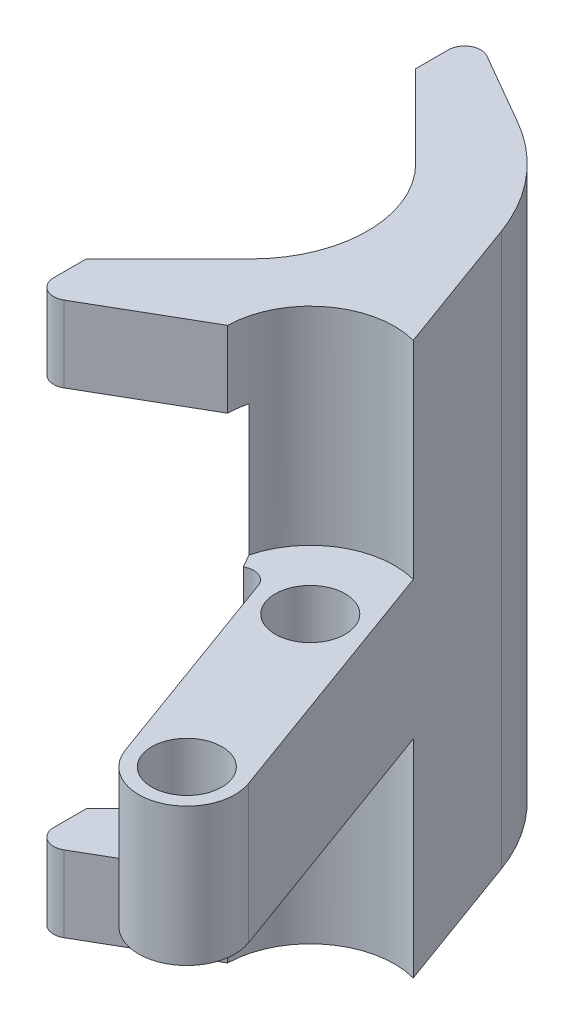
ISO-10303-21;
HEADER;
FILE_DESCRIPTION(('STEP AP214'),'2;1');
FILE_NAME('part.step','',(''),(''),'','','');
FILE_SCHEMA(('AUTOMOTIVE_DESIGN { 1 0 10303 214 1 1 1 1 }'));
ENDSEC;
DATA;
#1=APPLICATION_CONTEXT('core data for automotive mechanical design processes');
#2=APPLICATION_PROTOCOL_DEFINITION('international standard','automotive_design',2000,#1);
#3=PRODUCT_CONTEXT('',#1,'mechanical');
#4=PRODUCT('Part','Part','',(#3));
#5=PRODUCT_RELATED_PRODUCT_CATEGORY('part','',(#4));
#6=PRODUCT_DEFINITION_FORMATION('','',#4);
#7=PRODUCT_DEFINITION_CONTEXT('part definition',#1,'design');
#8=PRODUCT_DEFINITION('design','',#6,#7);
#9=PRODUCT_DEFINITION_SHAPE('','',#8);
#10=(LENGTH_UNIT() NAMED_UNIT(*) SI_UNIT(.MILLI.,.METRE.));
#11=(NAMED_UNIT(*) PLANE_ANGLE_UNIT() SI_UNIT($,.RADIAN.));
#12=(NAMED_UNIT(*) SI_UNIT($,.STERADIAN.) SOLID_ANGLE_UNIT());
#13=UNCERTAINTY_MEASURE_WITH_UNIT(LENGTH_MEASURE(1.E-05),#10,'distance_accuracy_value','');
#14=(GEOMETRIC_REPRESENTATION_CONTEXT(3) GLOBAL_UNCERTAINTY_ASSIGNED_CONTEXT((#13)) GLOBAL_UNIT_ASSIGNED_CONTEXT((#10,
#11,#12)) REPRESENTATION_CONTEXT('',''));
#15=CARTESIAN_POINT('',(0.,0.,0.));
#16=DIRECTION('',(0.,0.,1.));
#17=DIRECTION('',(1.,0.,0.));
#18=AXIS2_PLACEMENT_3D('',#15,#16,#17);
#19=CARTESIAN_POINT('',(16.8881397814251,50.8,-6.14678019256554));
#20=DIRECTION('',(-0.93969262078591,0.,0.342020143325663));
#21=DIRECTION('',(0.342020143325663,0.,0.939692620785911));
#22=AXIS2_PLACEMENT_3D('',#19,#20,#21);
#23=PLANE('',#22);
#24=DIRECTION('',(0.,1.,0.));
#25=VECTOR('',#24,1.);
#26=CARTESIAN_POINT('',(21.5258305874455,0.,6.59517057538795));
#27=LINE('',#26,#25);
#28=CARTESIAN_POINT('',(21.5258305874455,0.,6.59517057538795));
#29=VERTEX_POINT('',#28);
#30=CARTESIAN_POINT('',(21.5258305874455,19.05,6.59517057538796));
#31=VERTEX_POINT('',#30);
#32=EDGE_CURVE('E437',#29,#31,#27,.T.);
#33=ORIENTED_EDGE('',*,*,#32,.F.);
#34=DIRECTION('',(-0.342020143325663,0.,-0.939692620785911));
#35=VECTOR('',#34,1.);
#36=CARTESIAN_POINT('',(16.8881397814251,0.,-6.14678019256554));
#37=LINE('',#36,#35);
#38=CARTESIAN_POINT('',(16.8881397814251,0.,-6.14678019256554));
#39=VERTEX_POINT('',#38);
#40=EDGE_CURVE('E216',#29,#39,#37,.T.);
#41=ORIENTED_EDGE('',*,*,#40,.T.);
#42=DIRECTION('',(0.,-1.,0.));
#43=VECTOR('',#42,1.);
#44=CARTESIAN_POINT('',(16.8881397814251,50.8,-6.14678019256554));
#45=LINE('',#44,#43);
#46=CARTESIAN_POINT('',(16.8881397814251,50.8,-6.14678019256554));
#47=VERTEX_POINT('',#46);
#48=EDGE_CURVE('E257',#47,#39,#45,.T.);
#49=ORIENTED_EDGE('',*,*,#48,.F.);
#50=DIRECTION('',(-0.342020143325663,0.,-0.939692620785911));
#51=VECTOR('',#50,1.);
#52=CARTESIAN_POINT('',(16.8881397814251,50.8,-6.14678019256554));
#53=LINE('',#52,#51);
#54=CARTESIAN_POINT('',(21.5258305874454,50.8,6.59517057538778));
#55=VERTEX_POINT('',#54);
#56=EDGE_CURVE('E354',#55,#47,#53,.T.);
#57=ORIENTED_EDGE('',*,*,#56,.F.);
#58=DIRECTION('',(0.,-1.,0.));
#59=VECTOR('',#58,1.);
#60=CARTESIAN_POINT('',(21.5258305874454,50.8,6.59517057538778));
#61=LINE('',#60,#59);
#62=CARTESIAN_POINT('',(21.5258305874454,31.7499999999999,6.59517057538778));
#63=VERTEX_POINT('',#62);
#64=EDGE_CURVE('E422',#63,#55,#61,.F.);
#65=ORIENTED_EDGE('',*,*,#64,.F.);
#66=DIRECTION('',(-0.342020143325663,0.,-0.939692620785911));
#67=VECTOR('',#66,1.);
#68=CARTESIAN_POINT('',(16.8881397814251,31.7499999999999,-6.14678019256555));
#69=LINE('',#68,#67);
#70=CARTESIAN_POINT('',(30.2003290714799,31.7499999999999,30.4281592853664));
#71=VERTEX_POINT('',#70);
#72=EDGE_CURVE('E340',#71,#63,#69,.T.);
#73=ORIENTED_EDGE('',*,*,#72,.F.);
#74=DIRECTION('',(0.,-1.,0.));
#75=VECTOR('',#74,1.);
#76=CARTESIAN_POINT('',(30.2003290714799,50.8,30.4281592853664));
#77=LINE('',#76,#75);
#78=CARTESIAN_POINT('',(30.2003290714799,19.05,30.4281592853664));
#79=VERTEX_POINT('',#78);
#80=EDGE_CURVE('E260',#71,#79,#77,.T.);
#81=ORIENTED_EDGE('',*,*,#80,.T.);
#82=DIRECTION('',(-0.342020143325663,0.,-0.939692620785911));
#83=VECTOR('',#82,1.);
#84=CARTESIAN_POINT('',(16.8881397814251,19.05,-6.14678019256555));
#85=LINE('',#84,#83);
#86=EDGE_CURVE('E413',#79,#31,#85,.T.);
#87=ORIENTED_EDGE('',*,*,#86,.T.);
#88=EDGE_LOOP('',(#33,#41,#49,#57,#65,#73,#81,#87));
#89=FACE_BOUND('',#88,.T.);
#90=ADVANCED_FACE('F34',(#89),#23,.F.);
#91=CARTESIAN_POINT('',(7.71520805666691,7.,4.750875583494));
#92=DIRECTION('',(0.866025403784435,0.,-0.500000000000006));
#93=DIRECTION('',(-0.500000000000006,0.,-0.866025403784435));
#94=AXIS2_PLACEMENT_3D('',#91,#92,#93);
#95=PLANE('',#94);
#96=DIRECTION('',(0.,1.,0.));
#97=VECTOR('',#96,1.);
#98=CARTESIAN_POINT('',(12.0237702711242,0.,12.2135242465054));
#99=LINE('',#98,#97);
#100=CARTESIAN_POINT('',(12.0237702711242,19.05,12.2135242465054));
#101=VERTEX_POINT('',#100);
#102=CARTESIAN_POINT('',(12.0237702711242,7.,12.2135242465054));
#103=VERTEX_POINT('',#102);
#104=EDGE_CURVE('E48',#101,#103,#99,.F.);
#105=ORIENTED_EDGE('',*,*,#104,.F.);
#106=DIRECTION('',(-0.500000000000006,0.,-0.866025403784435));
#107=VECTOR('',#106,1.);
#108=CARTESIAN_POINT('',(7.71520805666691,19.05,4.750875583494));
#109=LINE('',#108,#107);
#110=CARTESIAN_POINT('',(12.715208056667,19.05,13.4111296213383));
#111=VERTEX_POINT('',#110);
#112=EDGE_CURVE('E434',#111,#101,#109,.T.);
#113=ORIENTED_EDGE('',*,*,#112,.F.);
#114=DIRECTION('',(0.,-1.,0.));
#115=VECTOR('',#114,1.);
#116=CARTESIAN_POINT('',(12.715208056667,50.8,13.4111296213383));
#117=LINE('',#116,#115);
#118=CARTESIAN_POINT('',(12.715208056667,31.7499999999999,13.4111296213384));
#119=VERTEX_POINT('',#118);
#120=EDGE_CURVE('E269',#119,#111,#117,.T.);
#121=ORIENTED_EDGE('',*,*,#120,.F.);
#122=DIRECTION('',(0.500000000000006,0.,0.866025403784435));
#123=VECTOR('',#122,1.);
#124=CARTESIAN_POINT('',(7.71520805666691,31.7499999999999,4.750875583494));
#125=LINE('',#124,#123);
#126=CARTESIAN_POINT('',(12.0237702711241,31.7499999999999,12.2135242465052));
#127=VERTEX_POINT('',#126);
#128=EDGE_CURVE('E299',#127,#119,#125,.T.);
#129=ORIENTED_EDGE('',*,*,#128,.F.);
#130=DIRECTION('',(0.,-1.,0.));
#131=VECTOR('',#130,1.);
#132=CARTESIAN_POINT('',(12.0237702711241,50.8,12.2135242465052));
#133=LINE('',#132,#131);
#134=CARTESIAN_POINT('',(12.0237702711241,43.8,12.2135242465052));
#135=VERTEX_POINT('',#134);
#136=EDGE_CURVE('E42',#135,#127,#133,.T.);
#137=ORIENTED_EDGE('',*,*,#136,.F.);
#138=DIRECTION('',(0.500000000000006,0.,0.866025403784435));
#139=VECTOR('',#138,1.);
#140=CARTESIAN_POINT('',(7.71520805666691,43.8,4.750875583494));
#141=LINE('',#140,#139);
#142=CARTESIAN_POINT('',(8.63538303421422,43.8,6.34466539645947));
#143=VERTEX_POINT('',#142);
#144=EDGE_CURVE('E384',#143,#135,#141,.T.);
#145=ORIENTED_EDGE('',*,*,#144,.F.);
#146=DIRECTION('',(0.,-1.,0.));
#147=VECTOR('',#146,1.);
#148=CARTESIAN_POINT('',(8.63538303421422,50.8,6.34466539645946));
#149=LINE('',#148,#147);
#150=CARTESIAN_POINT('',(8.63538303421422,7.00000000000001,6.34466539645946));
#151=VERTEX_POINT('',#150);
#152=EDGE_CURVE('E397',#151,#143,#149,.F.);
#153=ORIENTED_EDGE('',*,*,#152,.F.);
#154=DIRECTION('',(0.500000000000006,0.,0.866025403784435));
#155=VECTOR('',#154,1.);
#156=CARTESIAN_POINT('',(7.71520805666691,7.,4.750875583494));
#157=LINE('',#156,#155);
#158=EDGE_CURVE('E388',#151,#103,#157,.T.);
#159=ORIENTED_EDGE('',*,*,#158,.T.);
#160=EDGE_LOOP('',(#105,#113,#121,#129,#137,#145,#153,#159));
#161=FACE_BOUND('',#160,.T.);
#162=ADVANCED_FACE('F311',(#161),#95,.F.);
#163=CARTESIAN_POINT('',(2.24999999999989,50.8,19.4532203099806));
#164=DIRECTION('',(-0.500000000000006,0.,-0.866025403784435));
#165=DIRECTION('',(-0.866025403784435,0.,0.500000000000006));
#166=AXIS2_PLACEMENT_3D('',#163,#164,#165);
#167=PLANE('',#166);
#168=DIRECTION('',(0.,1.,0.));
#169=VECTOR('',#168,1.);
#170=CARTESIAN_POINT('',(11.7951653575316,0.,13.9423165213501));
#171=LINE('',#170,#169);
#172=CARTESIAN_POINT('',(11.7951653575316,7.,13.9423165213501));
#173=VERTEX_POINT('',#172);
#174=CARTESIAN_POINT('',(11.7951653575316,0.,13.9423165213501));
#175=VERTEX_POINT('',#174);
#176=EDGE_CURVE('E199',#173,#175,#171,.F.);
#177=ORIENTED_EDGE('',*,*,#176,.F.);
#178=DIRECTION('',(-0.866025403784435,0.,0.500000000000006));
#179=VECTOR('',#178,1.);
#180=CARTESIAN_POINT('',(2.2499999999999,7.00000000000001,19.4532203099806));
#181=LINE('',#180,#179);
#182=CARTESIAN_POINT('',(2.24999999999989,7.00000000000001,19.4532203099806));
#183=VERTEX_POINT('',#182);
#184=EDGE_CURVE('E287',#173,#183,#181,.T.);
#185=ORIENTED_EDGE('',*,*,#184,.T.);
#186=DIRECTION('',(0.,-1.,0.));
#187=VECTOR('',#186,1.);
#188=CARTESIAN_POINT('',(2.24999999999989,50.8,19.4532203099806));
#189=LINE('',#188,#187);
#190=CARTESIAN_POINT('',(2.24999999999989,0.,19.4532203099806));
#191=VERTEX_POINT('',#190);
#192=EDGE_CURVE('E221',#183,#191,#189,.T.);
#193=ORIENTED_EDGE('',*,*,#192,.T.);
#194=DIRECTION('',(0.866025403784435,0.,-0.500000000000006));
#195=VECTOR('',#194,1.);
#196=CARTESIAN_POINT('',(2.24999999999989,0.,19.4532203099806));
#197=LINE('',#196,#195);
#198=EDGE_CURVE('E214',#191,#175,#197,.T.);
#199=ORIENTED_EDGE('',*,*,#198,.T.);
#200=EDGE_LOOP('',(#177,#185,#193,#199));
#201=FACE_BOUND('',#200,.T.);
#202=ADVANCED_FACE('F219',(#201),#167,.F.);
#203=DIRECTION('',(0.,-1.,0.));
#204=VECTOR('',#203,1.);
#205=CARTESIAN_POINT('',(11.7951653575315,50.8,13.9423165213502));
#206=LINE('',#205,#204);
#207=CARTESIAN_POINT('',(11.7951653575314,50.8,13.9423165213502));
#208=VERTEX_POINT('',#207);
#209=CARTESIAN_POINT('',(11.7951653575315,43.8,13.9423165213502));
#210=VERTEX_POINT('',#209);
#211=EDGE_CURVE('E426',#208,#210,#206,.T.);
#212=ORIENTED_EDGE('',*,*,#211,.F.);
#213=DIRECTION('',(0.866025403784435,0.,-0.500000000000006));
#214=VECTOR('',#213,1.);
#215=CARTESIAN_POINT('',(2.24999999999989,50.8,19.4532203099806));
#216=LINE('',#215,#214);
#217=CARTESIAN_POINT('',(2.24999999999989,50.8,19.4532203099806));
#218=VERTEX_POINT('',#217);
#219=EDGE_CURVE('E351',#218,#208,#216,.T.);
#220=ORIENTED_EDGE('',*,*,#219,.F.);
#221=CARTESIAN_POINT('',(2.24999999999989,43.8,19.4532203099806));
#222=VERTEX_POINT('',#221);
#223=EDGE_CURVE('E272',#218,#222,#189,.T.);
#224=ORIENTED_EDGE('',*,*,#223,.T.);
#225=DIRECTION('',(-0.866025403784436,0.,0.500000000000005));
#226=VECTOR('',#225,1.);
#227=CARTESIAN_POINT('',(-0.348076211353411,43.8,20.9532203099806));
#228=LINE('',#227,#226);
#229=EDGE_CURVE('E425',#210,#222,#228,.T.);
#230=ORIENTED_EDGE('',*,*,#229,.F.);
#231=EDGE_LOOP('',(#212,#220,#224,#230));
#232=FACE_BOUND('',#231,.T.);
#233=ADVANCED_FACE('F484',(#232),#167,.F.);
#234=CARTESIAN_POINT('',(7.57709110215208,50.8,7.57709110215212));
#235=DIRECTION('',(0.707106781186546,0.,0.707106781186549));
#236=DIRECTION('',(0.707106781186549,0.,-0.707106781186546));
#237=AXIS2_PLACEMENT_3D('',#234,#235,#236);
#238=PLANE('',#237);
#239=DIRECTION('',(0.,-1.,0.));
#240=VECTOR('',#239,1.);
#241=CARTESIAN_POINT('',(7.57709110215208,50.8,7.57709110215212));
#242=LINE('',#241,#240);
#243=CARTESIAN_POINT('',(7.57709110215208,50.8,7.57709110215212));
#244=VERTEX_POINT('',#243);
#245=CARTESIAN_POINT('',(7.57709110215208,43.8,7.57709110215212));
#246=VERTEX_POINT('',#245);
#247=EDGE_CURVE('E284',#244,#246,#242,.T.);
#248=ORIENTED_EDGE('',*,*,#247,.T.);
#249=DIRECTION('',(-0.707106781186549,0.,0.707106781186546));
#250=VECTOR('',#249,1.);
#251=CARTESIAN_POINT('',(7.57709110215208,43.8,7.57709110215212));
#252=LINE('',#251,#250);
#253=CARTESIAN_POINT('',(0.,43.8,15.1541822043042));
#254=VERTEX_POINT('',#253);
#255=EDGE_CURVE('E406',#246,#254,#252,.T.);
#256=ORIENTED_EDGE('',*,*,#255,.T.);
#257=DIRECTION('',(0.,-1.,0.));
#258=VECTOR('',#257,1.);
#259=CARTESIAN_POINT('',(0.,50.8,15.1541822043042));
#260=LINE('',#259,#258);
#261=CARTESIAN_POINT('',(0.,50.8,15.1541822043042));
#262=VERTEX_POINT('',#261);
#263=EDGE_CURVE('E280',#262,#254,#260,.T.);
#264=ORIENTED_EDGE('',*,*,#263,.F.);
#265=DIRECTION('',(-0.707106781186549,0.,0.707106781186546));
#266=VECTOR('',#265,1.);
#267=CARTESIAN_POINT('',(7.57709110215208,50.8,7.57709110215212));
#268=LINE('',#267,#266);
#269=EDGE_CURVE('E345',#244,#262,#268,.T.);
#270=ORIENTED_EDGE('',*,*,#269,.F.);
#271=EDGE_LOOP('',(#248,#256,#264,#270));
#272=FACE_BOUND('',#271,.T.);
#273=ADVANCED_FACE('F496',(#272),#238,.F.);
#274=CARTESIAN_POINT('',(0.,50.8,15.1541822043042));
#275=DIRECTION('',(1.,0.,0.));
#276=DIRECTION('',(0.,0.,-1.));
#277=AXIS2_PLACEMENT_3D('',#274,#275,#276);
#278=PLANE('',#277);
#279=ORIENTED_EDGE('',*,*,#263,.T.);
#280=DIRECTION('',(0.,0.,1.));
#281=VECTOR('',#280,1.);
#282=CARTESIAN_POINT('',(0.,43.8,15.1541822043042));
#283=LINE('',#282,#281);
#284=CARTESIAN_POINT('',(1.16009632455949E-13,43.8,18.1541822043042));
#285=VERTEX_POINT('',#284);
#286=EDGE_CURVE('E403',#254,#285,#283,.T.);
#287=ORIENTED_EDGE('',*,*,#286,.T.);
#288=DIRECTION('',(0.,-1.,0.));
#289=VECTOR('',#288,1.);
#290=CARTESIAN_POINT('',(1.16009632455949E-13,50.8,18.1541822043042));
#291=LINE('',#290,#289);
#292=CARTESIAN_POINT('',(1.16009632455949E-13,50.8,18.1541822043042));
#293=VERTEX_POINT('',#292);
#294=EDGE_CURVE('E276',#293,#285,#291,.T.);
#295=ORIENTED_EDGE('',*,*,#294,.F.);
#296=DIRECTION('',(0.,0.,1.));
#297=VECTOR('',#296,1.);
#298=CARTESIAN_POINT('',(0.,50.8,15.1541822043042));
#299=LINE('',#298,#297);
#300=EDGE_CURVE('E347',#262,#293,#299,.T.);
#301=ORIENTED_EDGE('',*,*,#300,.F.);
#302=EDGE_LOOP('',(#279,#287,#295,#301));
#303=FACE_BOUND('',#302,.T.);
#304=ADVANCED_FACE('F494',(#303),#278,.F.);
#305=CARTESIAN_POINT('',(1.5,50.8,18.1541822043042));
#306=DIRECTION('',(0.,-1.,0.));
#307=DIRECTION('',(0.,0.,-1.));
#308=AXIS2_PLACEMENT_3D('',#305,#306,#307);
#309=CYLINDRICAL_SURFACE('',#308,1.49999999999988);
#310=ORIENTED_EDGE('',*,*,#294,.T.);
#311=CARTESIAN_POINT('',(1.5,43.8,18.1541822043042));
#312=DIRECTION('',(0.,1.,0.));
#313=DIRECTION('',(0.,0.,1.));
#314=AXIS2_PLACEMENT_3D('',#311,#312,#313);
#315=CIRCLE('',#314,1.49999999999988);
#316=EDGE_CURVE('E400',#285,#222,#315,.T.);
#317=ORIENTED_EDGE('',*,*,#316,.T.);
#318=ORIENTED_EDGE('',*,*,#223,.F.);
#319=CARTESIAN_POINT('',(1.5,50.8,18.1541822043042));
#320=DIRECTION('',(0.,1.,0.));
#321=DIRECTION('',(0.,0.,1.));
#322=AXIS2_PLACEMENT_3D('',#319,#320,#321);
#323=CIRCLE('',#322,1.49999999999988);
#324=EDGE_CURVE('E349',#293,#218,#323,.T.);
#325=ORIENTED_EDGE('',*,*,#324,.F.);
#326=EDGE_LOOP('',(#310,#317,#318,#325));
#327=FACE_BOUND('',#326,.T.);
#328=ADVANCED_FACE('F489',(#327),#309,.T.);
#329=CARTESIAN_POINT('',(0.,0.,0.));
#330=DIRECTION('',(0.,-1.,0.));
#331=DIRECTION('',(0.,0.,-1.));
#332=AXIS2_PLACEMENT_3D('',#329,#330,#331);
#333=PLANE('',#332);
#334=ORIENTED_EDGE('',*,*,#40,.F.);
#335=CARTESIAN_POINT('',(19.5438065013148,0.,14.08743862465));
#336=DIRECTION('',(0.,-1.,0.));
#337=DIRECTION('',(1.,0.,0.));
#338=AXIS2_PLACEMENT_3D('',#335,#336,#337);
#339=CIRCLE('',#338,7.74999999999971);
#340=EDGE_CURVE('E203',#175,#29,#339,.T.);
#341=ORIENTED_EDGE('',*,*,#340,.F.);
#342=ORIENTED_EDGE('',*,*,#198,.F.);
#343=CARTESIAN_POINT('',(1.5,0.,18.1541822043042));
#344=DIRECTION('',(0.,1.,0.));
#345=DIRECTION('',(0.,0.,1.));
#346=AXIS2_PLACEMENT_3D('',#343,#344,#345);
#347=CIRCLE('',#346,1.49999999999988);
#348=CARTESIAN_POINT('',(1.16009632455949E-13,0.,18.1541822043042));
#349=VERTEX_POINT('',#348);
#350=EDGE_CURVE('E223',#349,#191,#347,.T.);
#351=ORIENTED_EDGE('',*,*,#350,.F.);
#352=DIRECTION('',(0.,0.,1.));
#353=VECTOR('',#352,1.);
#354=CARTESIAN_POINT('',(0.,0.,15.1541822043042));
#355=LINE('',#354,#353);
#356=CARTESIAN_POINT('',(0.,0.,15.1541822043042));
#357=VERTEX_POINT('',#356);
#358=EDGE_CURVE('E227',#357,#349,#355,.T.);
#359=ORIENTED_EDGE('',*,*,#358,.F.);
#360=DIRECTION('',(-0.707106781186549,0.,0.707106781186546));
#361=VECTOR('',#360,1.);
#362=CARTESIAN_POINT('',(7.57709110215208,0.,7.57709110215212));
#363=LINE('',#362,#361);
#364=CARTESIAN_POINT('',(7.57709110215208,0.,7.57709110215212));
#365=VERTEX_POINT('',#364);
#366=EDGE_CURVE('E367',#365,#357,#363,.T.);
#367=ORIENTED_EDGE('',*,*,#366,.F.);
#368=CARTESIAN_POINT('',(0.,0.,0.));
#369=DIRECTION('',(0.,-1.,0.));
#370=DIRECTION('',(0.,0.,-1.));
#371=AXIS2_PLACEMENT_3D('',#368,#369,#370);
#372=CIRCLE('',#371,10.715625);
#373=CARTESIAN_POINT('',(7.57709110215208,0.,-7.57709110215211));
#374=VERTEX_POINT('',#373);
#375=EDGE_CURVE('E321',#374,#365,#372,.T.);
#376=ORIENTED_EDGE('',*,*,#375,.F.);
#377=DIRECTION('',(0.707106781186549,0.,0.707106781186546));
#378=VECTOR('',#377,1.);
#379=CARTESIAN_POINT('',(7.57709110215208,0.,-7.57709110215211));
#380=LINE('',#379,#378);
#381=CARTESIAN_POINT('',(0.,0.,-15.1541822043042));
#382=VERTEX_POINT('',#381);
#383=EDGE_CURVE('E238',#382,#374,#380,.T.);
#384=ORIENTED_EDGE('',*,*,#383,.F.);
#385=DIRECTION('',(0.,0.,1.));
#386=VECTOR('',#385,1.);
#387=CARTESIAN_POINT('',(0.,0.,-15.1541822043042));
#388=LINE('',#387,#386);
#389=CARTESIAN_POINT('',(0.,0.,-18.1541822043042));
#390=VERTEX_POINT('',#389);
#391=EDGE_CURVE('E236',#390,#382,#388,.T.);
#392=ORIENTED_EDGE('',*,*,#391,.F.);
#393=CARTESIAN_POINT('',(1.5,0.,-18.1541822043042));
#394=DIRECTION('',(0.,1.,0.));
#395=DIRECTION('',(0.,0.,-1.));
#396=AXIS2_PLACEMENT_3D('',#393,#394,#395);
#397=CIRCLE('',#396,1.5);
#398=CARTESIAN_POINT('',(2.25000000000001,0.,-19.4532203099808));
#399=VERTEX_POINT('',#398);
#400=EDGE_CURVE('E234',#399,#390,#397,.T.);
#401=ORIENTED_EDGE('',*,*,#400,.F.);
#402=DIRECTION('',(-0.866025403784436,0.,-0.500000000000005));
#403=VECTOR('',#402,1.);
#404=CARTESIAN_POINT('',(2.25000000000001,0.,-19.4532203099808));
#405=LINE('',#404,#403);
#406=CARTESIAN_POINT('',(8.98599148692944,0.,-15.564193811743));
#407=VERTEX_POINT('',#406);
#408=EDGE_CURVE('E232',#407,#399,#405,.T.);
#409=ORIENTED_EDGE('',*,*,#408,.F.);
#410=CARTESIAN_POINT('',(0.,0.,0.));
#411=DIRECTION('',(0.,1.,0.));
#412=DIRECTION('',(0.,0.,-1.));
#413=AXIS2_PLACEMENT_3D('',#410,#411,#412);
#414=CIRCLE('',#413,17.9719829738587);
#415=EDGE_CURVE('E225',#39,#407,#414,.T.);
#416=ORIENTED_EDGE('',*,*,#415,.F.);
#417=EDGE_LOOP('',(#334,#341,#342,#351,#359,#367,#376,#384,#392,#401,#409,#416));
#418=FACE_BOUND('',#417,.T.);
#419=ADVANCED_FACE('F212',(#418),#333,.T.);
#420=CARTESIAN_POINT('',(13.465208056667,50.8,14.710167727015));
#421=DIRECTION('',(0.,-1.,0.));
#422=DIRECTION('',(0.,0.,-1.));
#423=AXIS2_PLACEMENT_3D('',#420,#421,#422);
#424=CYLINDRICAL_SURFACE('',#423,1.5);
#425=CARTESIAN_POINT('',(13.465208056667,31.7499999999999,14.710167727015));
#426=DIRECTION('',(0.,1.,0.));
#427=DIRECTION('',(-1.,0.,0.));
#428=AXIS2_PLACEMENT_3D('',#425,#426,#427);
#429=CIRCLE('',#428,1.5);
#430=CARTESIAN_POINT('',(14.8747469878459,31.7499999999999,14.1971375120265));
#431=VERTEX_POINT('',#430);
#432=EDGE_CURVE('E315',#119,#431,#429,.F.);
#433=ORIENTED_EDGE('',*,*,#432,.F.);
#434=ORIENTED_EDGE('',*,*,#120,.T.);
#435=CARTESIAN_POINT('',(13.465208056667,19.05,14.710167727015));
#436=DIRECTION('',(0.,1.,0.));
#437=DIRECTION('',(-1.,0.,0.));
#438=AXIS2_PLACEMENT_3D('',#435,#436,#437);
#439=CIRCLE('',#438,1.5);
#440=CARTESIAN_POINT('',(14.8747469878459,19.05,14.1971375120265));
#441=VERTEX_POINT('',#440);
#442=EDGE_CURVE('E297',#111,#441,#439,.F.);
#443=ORIENTED_EDGE('',*,*,#442,.T.);
#444=DIRECTION('',(0.,-1.,0.));
#445=VECTOR('',#444,1.);
#446=CARTESIAN_POINT('',(14.8747469878459,50.8,14.1971375120265));
#447=LINE('',#446,#445);
#448=EDGE_CURVE('E266',#431,#441,#447,.T.);
#449=ORIENTED_EDGE('',*,*,#448,.F.);
#450=EDGE_LOOP('',(#433,#434,#443,#449));
#451=FACE_BOUND('',#450,.T.);
#452=ADVANCED_FACE('F329',(#451),#424,.F.);
#453=CARTESIAN_POINT('',(14.8747469878459,50.8,14.1971375120265));
#454=DIRECTION('',(0.93969262078591,0.,-0.342020143325663));
#455=DIRECTION('',(-0.342020143325663,0.,-0.939692620785911));
#456=AXIS2_PLACEMENT_3D('',#453,#454,#455);
#457=PLANE('',#456);
#458=DIRECTION('',(0.342020143325663,0.,0.939692620785911));
#459=VECTOR('',#458,1.);
#460=CARTESIAN_POINT('',(14.8747469878459,31.7499999999999,14.1971375120265));
#461=LINE('',#460,#459);
#462=CARTESIAN_POINT('',(21.8840493775246,31.7499999999999,33.4550375537986));
#463=VERTEX_POINT('',#462);
#464=EDGE_CURVE('E317',#431,#463,#461,.T.);
#465=ORIENTED_EDGE('',*,*,#464,.F.);
#466=ORIENTED_EDGE('',*,*,#448,.T.);
#467=DIRECTION('',(0.342020143325663,0.,0.939692620785911));
#468=VECTOR('',#467,1.);
#469=CARTESIAN_POINT('',(14.8747469878459,19.05,14.1971375120265));
#470=LINE('',#469,#468);
#471=CARTESIAN_POINT('',(21.8840493775246,19.05,33.4550375537986));
#472=VERTEX_POINT('',#471);
#473=EDGE_CURVE('E332',#441,#472,#470,.T.);
#474=ORIENTED_EDGE('',*,*,#473,.T.);
#475=DIRECTION('',(0.,-1.,0.));
#476=VECTOR('',#475,1.);
#477=CARTESIAN_POINT('',(21.8840493775246,50.8,33.4550375537986));
#478=LINE('',#477,#476);
#479=EDGE_CURVE('E263',#463,#472,#478,.T.);
#480=ORIENTED_EDGE('',*,*,#479,.F.);
#481=EDGE_LOOP('',(#465,#466,#474,#480));
#482=FACE_BOUND('',#481,.T.);
#483=ADVANCED_FACE('F325',(#482),#457,.F.);
#484=CARTESIAN_POINT('',(26.0421892245023,50.8,31.9415984195825));
#485=DIRECTION('',(0.,-1.,0.));
#486=DIRECTION('',(0.,0.,-1.));
#487=AXIS2_PLACEMENT_3D('',#484,#485,#486);
#488=CYLINDRICAL_SURFACE('',#487,4.425);
#489=CARTESIAN_POINT('',(26.0421892245023,31.7499999999999,31.9415984195825));
#490=DIRECTION('',(0.,1.,0.));
#491=DIRECTION('',(-1.,0.,0.));
#492=AXIS2_PLACEMENT_3D('',#489,#490,#491);
#493=CIRCLE('',#492,4.425);
#494=EDGE_CURVE('E326',#463,#71,#493,.T.);
#495=ORIENTED_EDGE('',*,*,#494,.F.);
#496=ORIENTED_EDGE('',*,*,#479,.T.);
#497=CARTESIAN_POINT('',(26.0421892245023,19.05,31.9415984195825));
#498=DIRECTION('',(0.,1.,0.));
#499=DIRECTION('',(-1.,0.,0.));
#500=AXIS2_PLACEMENT_3D('',#497,#498,#499);
#501=CIRCLE('',#500,4.425);
#502=EDGE_CURVE('E334',#472,#79,#501,.T.);
#503=ORIENTED_EDGE('',*,*,#502,.T.);
#504=ORIENTED_EDGE('',*,*,#80,.F.);
#505=EDGE_LOOP('',(#495,#496,#503,#504));
#506=FACE_BOUND('',#505,.T.);
#507=ADVANCED_FACE('F418',(#506),#488,.T.);
#508=CARTESIAN_POINT('',(0.,50.8,0.));
#509=DIRECTION('',(0.,-1.,0.));
#510=DIRECTION('',(0.,0.,-1.));
#511=AXIS2_PLACEMENT_3D('',#508,#509,#510);
#512=PLANE('',#511);
#513=CARTESIAN_POINT('',(19.5438065013148,50.8,14.08743862465));
#514=DIRECTION('',(0.,1.,0.));
#515=DIRECTION('',(-1.,0.,0.));
#516=AXIS2_PLACEMENT_3D('',#513,#514,#515);
#517=CIRCLE('',#516,7.74999999999987);
#518=EDGE_CURVE('E432',#55,#208,#517,.T.);
#519=ORIENTED_EDGE('',*,*,#518,.F.);
#520=ORIENTED_EDGE('',*,*,#56,.T.);
#521=CARTESIAN_POINT('',(0.,50.8,0.));
#522=DIRECTION('',(0.,1.,0.));
#523=DIRECTION('',(0.,0.,-1.));
#524=AXIS2_PLACEMENT_3D('',#521,#522,#523);
#525=CIRCLE('',#524,17.9719829738587);
#526=CARTESIAN_POINT('',(8.98599148692944,50.8,-15.564193811743));
#527=VERTEX_POINT('',#526);
#528=EDGE_CURVE('E356',#47,#527,#525,.T.);
#529=ORIENTED_EDGE('',*,*,#528,.T.);
#530=DIRECTION('',(-0.866025403784436,0.,-0.500000000000005));
#531=VECTOR('',#530,1.);
#532=CARTESIAN_POINT('',(2.25000000000001,50.8,-19.4532203099808));
#533=LINE('',#532,#531);
#534=CARTESIAN_POINT('',(2.25000000000001,50.8,-19.4532203099808));
#535=VERTEX_POINT('',#534);
#536=EDGE_CURVE('E358',#527,#535,#533,.T.);
#537=ORIENTED_EDGE('',*,*,#536,.T.);
#538=CARTESIAN_POINT('',(1.5,50.8,-18.1541822043042));
#539=DIRECTION('',(0.,1.,0.));
#540=DIRECTION('',(0.,0.,-1.));
#541=AXIS2_PLACEMENT_3D('',#538,#539,#540);
#542=CIRCLE('',#541,1.5);
#543=CARTESIAN_POINT('',(0.,50.8,-18.1541822043042));
#544=VERTEX_POINT('',#543);
#545=EDGE_CURVE('E360',#535,#544,#542,.T.);
#546=ORIENTED_EDGE('',*,*,#545,.T.);
#547=DIRECTION('',(0.,0.,1.));
#548=VECTOR('',#547,1.);
#549=CARTESIAN_POINT('',(0.,50.8,-15.1541822043042));
#550=LINE('',#549,#548);
#551=CARTESIAN_POINT('',(0.,50.8,-15.1541822043042));
#552=VERTEX_POINT('',#551);
#553=EDGE_CURVE('E362',#544,#552,#550,.T.);
#554=ORIENTED_EDGE('',*,*,#553,.T.);
#555=DIRECTION('',(0.707106781186549,0.,0.707106781186546));
#556=VECTOR('',#555,1.);
#557=CARTESIAN_POINT('',(7.57709110215208,50.8,-7.57709110215211));
#558=LINE('',#557,#556);
#559=CARTESIAN_POINT('',(7.57709110215208,50.8,-7.57709110215211));
#560=VERTEX_POINT('',#559);
#561=EDGE_CURVE('E245',#552,#560,#558,.T.);
#562=ORIENTED_EDGE('',*,*,#561,.T.);
#563=CARTESIAN_POINT('',(0.,50.8,0.));
#564=DIRECTION('',(0.,-1.,0.));
#565=DIRECTION('',(0.,0.,-1.));
#566=AXIS2_PLACEMENT_3D('',#563,#564,#565);
#567=CIRCLE('',#566,10.715625);
#568=EDGE_CURVE('E240',#560,#244,#567,.T.);
#569=ORIENTED_EDGE('',*,*,#568,.T.);
#570=ORIENTED_EDGE('',*,*,#269,.T.);
#571=ORIENTED_EDGE('',*,*,#300,.T.);
#572=ORIENTED_EDGE('',*,*,#324,.T.);
#573=ORIENTED_EDGE('',*,*,#219,.T.);
#574=EDGE_LOOP('',(#519,#520,#529,#537,#546,#554,#562,#569,#570,#571,#572,#573));
#575=FACE_BOUND('',#574,.T.);
#576=ADVANCED_FACE('F462',(#575),#512,.F.);
#577=CARTESIAN_POINT('',(0.,50.8,0.));
#578=DIRECTION('',(0.,-1.,0.));
#579=DIRECTION('',(0.,0.,-1.));
#580=AXIS2_PLACEMENT_3D('',#577,#578,#579);
#581=CYLINDRICAL_SURFACE('',#580,10.715625);
#582=ORIENTED_EDGE('',*,*,#152,.T.);
#583=CARTESIAN_POINT('',(0.,43.8,0.));
#584=DIRECTION('',(0.,1.,0.));
#585=DIRECTION('',(0.,0.,1.));
#586=AXIS2_PLACEMENT_3D('',#583,#584,#585);
#587=CIRCLE('',#586,10.715625);
#588=EDGE_CURVE('E292',#143,#246,#587,.F.);
#589=ORIENTED_EDGE('',*,*,#588,.T.);
#590=ORIENTED_EDGE('',*,*,#247,.F.);
#591=ORIENTED_EDGE('',*,*,#568,.F.);
#592=DIRECTION('',(0.,-1.,0.));
#593=VECTOR('',#592,1.);
#594=CARTESIAN_POINT('',(7.57709110215208,50.8,-7.57709110215211));
#595=LINE('',#594,#593);
#596=EDGE_CURVE('E241',#560,#374,#595,.T.);
#597=ORIENTED_EDGE('',*,*,#596,.T.);
#598=ORIENTED_EDGE('',*,*,#375,.T.);
#599=CARTESIAN_POINT('',(7.57709110215208,7.00000000000001,7.57709110215212));
#600=VERTEX_POINT('',#599);
#601=EDGE_CURVE('E283',#600,#365,#242,.T.);
#602=ORIENTED_EDGE('',*,*,#601,.F.);
#603=CARTESIAN_POINT('',(0.,7.00000000000001,0.));
#604=DIRECTION('',(0.,-1.,0.));
#605=DIRECTION('',(1.,0.,0.));
#606=AXIS2_PLACEMENT_3D('',#603,#604,#605);
#607=CIRCLE('',#606,10.715625);
#608=EDGE_CURVE('E394',#600,#151,#607,.F.);
#609=ORIENTED_EDGE('',*,*,#608,.T.);
#610=EDGE_LOOP('',(#582,#589,#590,#591,#597,#598,#602,#609));
#611=FACE_BOUND('',#610,.T.);
#612=ADVANCED_FACE('F36',(#611),#581,.F.);
#613=CARTESIAN_POINT('',(0.,7.00000000000001,15.1541822043042));
#614=VERTEX_POINT('',#613);
#615=EDGE_CURVE('E279',#614,#357,#260,.T.);
#616=ORIENTED_EDGE('',*,*,#615,.F.);
#617=DIRECTION('',(0.707106781186549,0.,-0.707106781186546));
#618=VECTOR('',#617,1.);
#619=CARTESIAN_POINT('',(7.57709110215209,7.00000000000001,7.57709110215211));
#620=LINE('',#619,#618);
#621=EDGE_CURVE('E386',#614,#600,#620,.T.);
#622=ORIENTED_EDGE('',*,*,#621,.T.);
#623=ORIENTED_EDGE('',*,*,#601,.T.);
#624=ORIENTED_EDGE('',*,*,#366,.T.);
#625=EDGE_LOOP('',(#616,#622,#623,#624));
#626=FACE_BOUND('',#625,.T.);
#627=ADVANCED_FACE('F450',(#626),#238,.F.);
#628=CARTESIAN_POINT('',(1.16009632455949E-13,7.00000000000001,18.1541822043042));
#629=VERTEX_POINT('',#628);
#630=EDGE_CURVE('E275',#629,#349,#291,.T.);
#631=ORIENTED_EDGE('',*,*,#630,.F.);
#632=DIRECTION('',(0.,0.,-1.));
#633=VECTOR('',#632,1.);
#634=CARTESIAN_POINT('',(0.,7.00000000000001,15.1541822043042));
#635=LINE('',#634,#633);
#636=EDGE_CURVE('E383',#629,#614,#635,.T.);
#637=ORIENTED_EDGE('',*,*,#636,.T.);
#638=ORIENTED_EDGE('',*,*,#615,.T.);
#639=ORIENTED_EDGE('',*,*,#358,.T.);
#640=EDGE_LOOP('',(#631,#637,#638,#639));
#641=FACE_BOUND('',#640,.T.);
#642=ADVANCED_FACE('F373',(#641),#278,.F.);
#643=ORIENTED_EDGE('',*,*,#192,.F.);
#644=CARTESIAN_POINT('',(1.5,7.00000000000001,18.1541822043042));
#645=DIRECTION('',(0.,-1.,0.));
#646=DIRECTION('',(1.,0.,0.));
#647=AXIS2_PLACEMENT_3D('',#644,#645,#646);
#648=CIRCLE('',#647,1.49999999999988);
#649=EDGE_CURVE('E381',#183,#629,#648,.T.);
#650=ORIENTED_EDGE('',*,*,#649,.T.);
#651=ORIENTED_EDGE('',*,*,#630,.T.);
#652=ORIENTED_EDGE('',*,*,#350,.T.);
#653=EDGE_LOOP('',(#643,#650,#651,#652));
#654=FACE_BOUND('',#653,.T.);
#655=ADVANCED_FACE('F378',(#654),#309,.T.);
#656=CARTESIAN_POINT('',(0.,50.8,0.));
#657=DIRECTION('',(0.,-1.,0.));
#658=DIRECTION('',(0.,0.,-1.));
#659=AXIS2_PLACEMENT_3D('',#656,#657,#658);
#660=CYLINDRICAL_SURFACE('',#659,17.9719829738587);
#661=ORIENTED_EDGE('',*,*,#415,.T.);
#662=DIRECTION('',(0.,-1.,0.));
#663=VECTOR('',#662,1.);
#664=CARTESIAN_POINT('',(8.98599148692944,50.8,-15.564193811743));
#665=LINE('',#664,#663);
#666=EDGE_CURVE('E254',#527,#407,#665,.T.);
#667=ORIENTED_EDGE('',*,*,#666,.F.);
#668=ORIENTED_EDGE('',*,*,#528,.F.);
#669=ORIENTED_EDGE('',*,*,#48,.T.);
#670=EDGE_LOOP('',(#661,#667,#668,#669));
#671=FACE_BOUND('',#670,.T.);
#672=ADVANCED_FACE('F479',(#671),#660,.T.);
#673=CARTESIAN_POINT('',(2.25000000000001,50.8,-19.4532203099808));
#674=DIRECTION('',(-0.500000000000005,0.,0.866025403784436));
#675=DIRECTION('',(0.866025403784436,0.,0.500000000000005));
#676=AXIS2_PLACEMENT_3D('',#673,#674,#675);
#677=PLANE('',#676);
#678=ORIENTED_EDGE('',*,*,#408,.T.);
#679=DIRECTION('',(0.,-1.,0.));
#680=VECTOR('',#679,1.);
#681=CARTESIAN_POINT('',(2.25000000000001,50.8,-19.4532203099808));
#682=LINE('',#681,#680);
#683=EDGE_CURVE('E251',#535,#399,#682,.T.);
#684=ORIENTED_EDGE('',*,*,#683,.F.);
#685=ORIENTED_EDGE('',*,*,#536,.F.);
#686=ORIENTED_EDGE('',*,*,#666,.T.);
#687=EDGE_LOOP('',(#678,#684,#685,#686));
#688=FACE_BOUND('',#687,.T.);
#689=ADVANCED_FACE('F474',(#688),#677,.F.);
#690=CARTESIAN_POINT('',(1.5,50.8,-18.1541822043042));
#691=DIRECTION('',(0.,-1.,0.));
#692=DIRECTION('',(0.,0.,-1.));
#693=AXIS2_PLACEMENT_3D('',#690,#691,#692);
#694=CYLINDRICAL_SURFACE('',#693,1.5);
#695=ORIENTED_EDGE('',*,*,#400,.T.);
#696=DIRECTION('',(0.,-1.,0.));
#697=VECTOR('',#696,1.);
#698=CARTESIAN_POINT('',(0.,50.8,-18.1541822043042));
#699=LINE('',#698,#697);
#700=EDGE_CURVE('E248',#544,#390,#699,.T.);
#701=ORIENTED_EDGE('',*,*,#700,.F.);
#702=ORIENTED_EDGE('',*,*,#545,.F.);
#703=ORIENTED_EDGE('',*,*,#683,.T.);
#704=EDGE_LOOP('',(#695,#701,#702,#703));
#705=FACE_BOUND('',#704,.T.);
#706=ADVANCED_FACE('F470',(#705),#694,.T.);
#707=CARTESIAN_POINT('',(0.,50.8,-15.1541822043042));
#708=DIRECTION('',(1.,0.,0.));
#709=DIRECTION('',(0.,0.,-1.));
#710=AXIS2_PLACEMENT_3D('',#707,#708,#709);
#711=PLANE('',#710);
#712=ORIENTED_EDGE('',*,*,#391,.T.);
#713=DIRECTION('',(0.,-1.,0.));
#714=VECTOR('',#713,1.);
#715=CARTESIAN_POINT('',(0.,50.8,-15.1541822043042));
#716=LINE('',#715,#714);
#717=EDGE_CURVE('E244',#552,#382,#716,.T.);
#718=ORIENTED_EDGE('',*,*,#717,.F.);
#719=ORIENTED_EDGE('',*,*,#553,.F.);
#720=ORIENTED_EDGE('',*,*,#700,.T.);
#721=EDGE_LOOP('',(#712,#718,#719,#720));
#722=FACE_BOUND('',#721,.T.);
#723=ADVANCED_FACE('F468',(#722),#711,.F.);
#724=CARTESIAN_POINT('',(7.57709110215208,50.8,-7.57709110215211));
#725=DIRECTION('',(0.707106781186546,0.,-0.707106781186549));
#726=DIRECTION('',(-0.707106781186549,0.,-0.707106781186546));
#727=AXIS2_PLACEMENT_3D('',#724,#725,#726);
#728=PLANE('',#727);
#729=ORIENTED_EDGE('',*,*,#383,.T.);
#730=ORIENTED_EDGE('',*,*,#596,.F.);
#731=ORIENTED_EDGE('',*,*,#561,.F.);
#732=ORIENTED_EDGE('',*,*,#717,.T.);
#733=EDGE_LOOP('',(#729,#730,#731,#732));
#734=FACE_BOUND('',#733,.T.);
#735=ADVANCED_FACE('F456',(#734),#728,.F.);
#736=CARTESIAN_POINT('',(-88.1246173928003,19.05,104.835609893767));
#737=DIRECTION('',(0.,1.,0.));
#738=DIRECTION('',(-1.,0.,0.));
#739=AXIS2_PLACEMENT_3D('',#736,#737,#738);
#740=PLANE('',#739);
#741=ORIENTED_EDGE('',*,*,#502,.F.);
#742=ORIENTED_EDGE('',*,*,#473,.F.);
#743=ORIENTED_EDGE('',*,*,#442,.F.);
#744=ORIENTED_EDGE('',*,*,#112,.T.);
#745=CARTESIAN_POINT('',(19.5438065013148,19.05,14.08743862465));
#746=DIRECTION('',(0.,-1.,0.));
#747=DIRECTION('',(1.,0.,0.));
#748=AXIS2_PLACEMENT_3D('',#745,#746,#747);
#749=CIRCLE('',#748,7.74999999999971);
#750=EDGE_CURVE('E217',#101,#31,#749,.T.);
#751=ORIENTED_EDGE('',*,*,#750,.T.);
#752=ORIENTED_EDGE('',*,*,#86,.F.);
#753=EDGE_LOOP('',(#741,#742,#743,#744,#751,#752));
#754=FACE_BOUND('',#753,.T.);
#755=CARTESIAN_POINT('',(26.0421892245023,19.05,31.9415984195825));
#756=DIRECTION('',(0.,1.,0.));
#757=DIRECTION('',(-1.,0.,0.));
#758=AXIS2_PLACEMENT_3D('',#755,#756,#757);
#759=CIRCLE('',#758,3.22500000000069);
#760=CARTESIAN_POINT('',(22.8171892245016,19.05,31.9415984195825));
#761=VERTEX_POINT('',#760);
#762=EDGE_CURVE('E291',#761,#761,#759,.T.);
#763=ORIENTED_EDGE('',*,*,#762,.T.);
#764=EDGE_LOOP('',(#763));
#765=FACE_BOUND('',#764,.T.);
#766=CARTESIAN_POINT('',(19.5438065013148,19.05,14.08743862465));
#767=DIRECTION('',(0.,1.,0.));
#768=DIRECTION('',(-1.,0.,0.));
#769=AXIS2_PLACEMENT_3D('',#766,#767,#768);
#770=CIRCLE('',#769,3.22499999999971);
#771=CARTESIAN_POINT('',(16.3188065013151,19.05,14.08743862465));
#772=VERTEX_POINT('',#771);
#773=EDGE_CURVE('E288',#772,#772,#770,.T.);
#774=ORIENTED_EDGE('',*,*,#773,.T.);
#775=EDGE_LOOP('',(#774));
#776=FACE_BOUND('',#775,.T.);
#777=ADVANCED_FACE('F441',(#754,#765,#776),#740,.F.);
#778=CARTESIAN_POINT('',(-88.1246173928003,31.7499999999999,104.835609893767));
#779=DIRECTION('',(0.,1.,0.));
#780=DIRECTION('',(-1.,0.,0.));
#781=AXIS2_PLACEMENT_3D('',#778,#779,#780);
#782=PLANE('',#781);
#783=CARTESIAN_POINT('',(26.0421892245023,31.7499999999999,31.9415984195825));
#784=DIRECTION('',(0.,1.,0.));
#785=DIRECTION('',(-1.,0.,0.));
#786=AXIS2_PLACEMENT_3D('',#783,#784,#785);
#787=CIRCLE('',#786,3.22500000000069);
#788=CARTESIAN_POINT('',(22.8171892245016,31.7499999999999,31.9415984195825));
#789=VERTEX_POINT('',#788);
#790=EDGE_CURVE('E296',#789,#789,#787,.T.);
#791=ORIENTED_EDGE('',*,*,#790,.F.);
#792=EDGE_LOOP('',(#791));
#793=FACE_BOUND('',#792,.T.);
#794=ORIENTED_EDGE('',*,*,#72,.T.);
#795=CARTESIAN_POINT('',(19.5438065013148,31.7499999999999,14.08743862465));
#796=DIRECTION('',(0.,1.,0.));
#797=DIRECTION('',(-1.,0.,0.));
#798=AXIS2_PLACEMENT_3D('',#795,#796,#797);
#799=CIRCLE('',#798,7.74999999999987);
#800=EDGE_CURVE('E56',#63,#127,#799,.T.);
#801=ORIENTED_EDGE('',*,*,#800,.T.);
#802=ORIENTED_EDGE('',*,*,#128,.T.);
#803=ORIENTED_EDGE('',*,*,#432,.T.);
#804=ORIENTED_EDGE('',*,*,#464,.T.);
#805=ORIENTED_EDGE('',*,*,#494,.T.);
#806=EDGE_LOOP('',(#794,#801,#802,#803,#804,#805));
#807=FACE_BOUND('',#806,.T.);
#808=CARTESIAN_POINT('',(19.5438065013148,31.7499999999999,14.08743862465));
#809=DIRECTION('',(0.,1.,0.));
#810=DIRECTION('',(-1.,0.,0.));
#811=AXIS2_PLACEMENT_3D('',#808,#809,#810);
#812=CIRCLE('',#811,3.22499999999971);
#813=CARTESIAN_POINT('',(16.3188065013151,31.7499999999999,14.08743862465));
#814=VERTEX_POINT('',#813);
#815=EDGE_CURVE('E293',#814,#814,#812,.T.);
#816=ORIENTED_EDGE('',*,*,#815,.F.);
#817=EDGE_LOOP('',(#816));
#818=FACE_BOUND('',#817,.T.);
#819=ADVANCED_FACE('F313',(#793,#807,#818),#782,.T.);
#820=CARTESIAN_POINT('',(26.0421892245023,50.8,31.9415984195825));
#821=DIRECTION('',(0.,-1.,0.));
#822=DIRECTION('',(0.,0.,-1.));
#823=AXIS2_PLACEMENT_3D('',#820,#821,#822);
#824=CYLINDRICAL_SURFACE('',#823,3.22500000000069);
#825=ORIENTED_EDGE('',*,*,#762,.F.);
#826=EDGE_LOOP('',(#825));
#827=FACE_BOUND('',#826,.T.);
#828=ORIENTED_EDGE('',*,*,#790,.T.);
#829=EDGE_LOOP('',(#828));
#830=FACE_BOUND('',#829,.T.);
#831=ADVANCED_FACE('F576',(#827,#830),#824,.F.);
#832=CARTESIAN_POINT('',(19.5438065013148,50.8,14.08743862465));
#833=DIRECTION('',(0.,-1.,0.));
#834=DIRECTION('',(0.,0.,-1.));
#835=AXIS2_PLACEMENT_3D('',#832,#833,#834);
#836=CYLINDRICAL_SURFACE('',#835,3.22499999999971);
#837=ORIENTED_EDGE('',*,*,#773,.F.);
#838=EDGE_LOOP('',(#837));
#839=FACE_BOUND('',#838,.T.);
#840=ORIENTED_EDGE('',*,*,#815,.T.);
#841=EDGE_LOOP('',(#840));
#842=FACE_BOUND('',#841,.T.);
#843=ADVANCED_FACE('F586',(#839,#842),#836,.F.);
#844=CARTESIAN_POINT('',(-5.34807621135347,43.8,12.2929662721363));
#845=DIRECTION('',(0.,1.,0.));
#846=DIRECTION('',(0.,0.,1.));
#847=AXIS2_PLACEMENT_3D('',#844,#845,#846);
#848=PLANE('',#847);
#849=CARTESIAN_POINT('',(19.5438065013148,43.8,14.08743862465));
#850=DIRECTION('',(0.,1.,0.));
#851=DIRECTION('',(0.,0.,1.));
#852=AXIS2_PLACEMENT_3D('',#849,#850,#851);
#853=CIRCLE('',#852,7.74999999999987);
#854=EDGE_CURVE('E306',#210,#135,#853,.F.);
#855=ORIENTED_EDGE('',*,*,#854,.F.);
#856=ORIENTED_EDGE('',*,*,#229,.T.);
#857=ORIENTED_EDGE('',*,*,#316,.F.);
#858=ORIENTED_EDGE('',*,*,#286,.F.);
#859=ORIENTED_EDGE('',*,*,#255,.F.);
#860=ORIENTED_EDGE('',*,*,#588,.F.);
#861=ORIENTED_EDGE('',*,*,#144,.T.);
#862=EDGE_LOOP('',(#855,#856,#857,#858,#859,#860,#861));
#863=FACE_BOUND('',#862,.T.);
#864=ADVANCED_FACE('F487',(#863),#848,.F.);
#865=CARTESIAN_POINT('',(7.71520805666691,7.,4.750875583494));
#866=DIRECTION('',(0.,-1.,0.));
#867=DIRECTION('',(1.,0.,0.));
#868=AXIS2_PLACEMENT_3D('',#865,#866,#867);
#869=PLANE('',#868);
#870=CARTESIAN_POINT('',(19.5438065013148,7.,14.08743862465));
#871=DIRECTION('',(0.,-1.,0.));
#872=DIRECTION('',(1.,0.,0.));
#873=AXIS2_PLACEMENT_3D('',#870,#871,#872);
#874=CIRCLE('',#873,7.74999999999971);
#875=EDGE_CURVE('E11',#103,#173,#874,.F.);
#876=ORIENTED_EDGE('',*,*,#875,.F.);
#877=ORIENTED_EDGE('',*,*,#158,.F.);
#878=ORIENTED_EDGE('',*,*,#608,.F.);
#879=ORIENTED_EDGE('',*,*,#621,.F.);
#880=ORIENTED_EDGE('',*,*,#636,.F.);
#881=ORIENTED_EDGE('',*,*,#649,.F.);
#882=ORIENTED_EDGE('',*,*,#184,.F.);
#883=EDGE_LOOP('',(#876,#877,#878,#879,#880,#881,#882));
#884=FACE_BOUND('',#883,.T.);
#885=ADVANCED_FACE('F445',(#884),#869,.F.);
#886=CARTESIAN_POINT('',(19.5438065013148,50.8,14.08743862465));
#887=DIRECTION('',(0.,-1.,0.));
#888=DIRECTION('',(1.,0.,0.));
#889=AXIS2_PLACEMENT_3D('',#886,#887,#888);
#890=CYLINDRICAL_SURFACE('',#889,7.74999999999987);
#891=ORIENTED_EDGE('',*,*,#64,.T.);
#892=ORIENTED_EDGE('',*,*,#518,.T.);
#893=ORIENTED_EDGE('',*,*,#211,.T.);
#894=ORIENTED_EDGE('',*,*,#854,.T.);
#895=ORIENTED_EDGE('',*,*,#136,.T.);
#896=ORIENTED_EDGE('',*,*,#800,.F.);
#897=EDGE_LOOP('',(#891,#892,#893,#894,#895,#896));
#898=FACE_BOUND('',#897,.T.);
#899=ADVANCED_FACE('F303',(#898),#890,.F.);
#900=CARTESIAN_POINT('',(19.5438065013148,0.,14.08743862465));
#901=DIRECTION('',(0.,1.,0.));
#902=DIRECTION('',(-1.,0.,0.));
#903=AXIS2_PLACEMENT_3D('',#900,#901,#902);
#904=CYLINDRICAL_SURFACE('',#903,7.74999999999971);
#905=ORIENTED_EDGE('',*,*,#32,.T.);
#906=ORIENTED_EDGE('',*,*,#750,.F.);
#907=ORIENTED_EDGE('',*,*,#104,.T.);
#908=ORIENTED_EDGE('',*,*,#875,.T.);
#909=ORIENTED_EDGE('',*,*,#176,.T.);
#910=ORIENTED_EDGE('',*,*,#340,.T.);
#911=EDGE_LOOP('',(#905,#906,#907,#908,#909,#910));
#912=FACE_BOUND('',#911,.T.);
#913=ADVANCED_FACE('F202',(#912),#904,.F.);
#914=CLOSED_SHELL('',(#90,#162,#202,#233,#273,#304,#328,#419,#452,#483,#507,#576,#612,#627,#642,
#655,#672,#689,#706,#723,#735,#777,#819,#831,#843,#864,#885,#899,#913));
#915=MANIFOLD_SOLID_BREP('B2',#914);
#916=ADVANCED_BREP_SHAPE_REPRESENTATION('',(#18,#915),#14);
#917=SHAPE_DEFINITION_REPRESENTATION(#9,#916);
ENDSEC;
END-ISO-10303-21;
